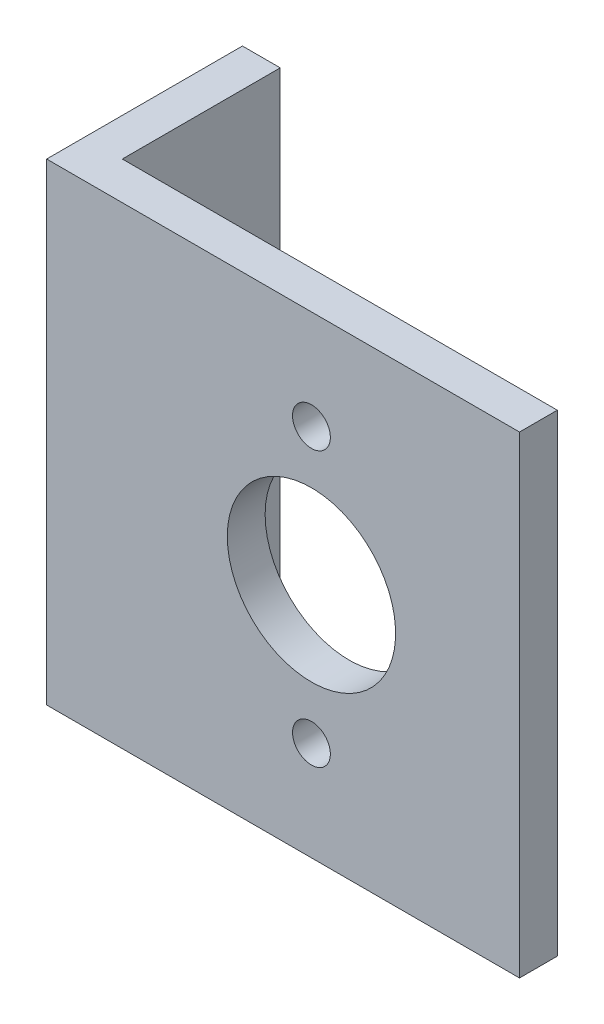
ISO-10303-21;
HEADER;
FILE_DESCRIPTION(('STEP AP214'),'2;1');
FILE_NAME('part.step','',(''),(''),'','','');
FILE_SCHEMA(('AUTOMOTIVE_DESIGN { 1 0 10303 214 1 1 1 1 }'));
ENDSEC;
DATA;
#1=APPLICATION_CONTEXT('core data for automotive mechanical design processes');
#2=APPLICATION_PROTOCOL_DEFINITION('international standard','automotive_design',2000,#1);
#3=PRODUCT_CONTEXT('',#1,'mechanical');
#4=PRODUCT('Part','Part','',(#3));
#5=PRODUCT_RELATED_PRODUCT_CATEGORY('part','',(#4));
#6=PRODUCT_DEFINITION_FORMATION('','',#4);
#7=PRODUCT_DEFINITION_CONTEXT('part definition',#1,'design');
#8=PRODUCT_DEFINITION('design','',#6,#7);
#9=PRODUCT_DEFINITION_SHAPE('','',#8);
#10=(LENGTH_UNIT() NAMED_UNIT(*) SI_UNIT(.MILLI.,.METRE.));
#11=(NAMED_UNIT(*) PLANE_ANGLE_UNIT() SI_UNIT($,.RADIAN.));
#12=(NAMED_UNIT(*) SI_UNIT($,.STERADIAN.) SOLID_ANGLE_UNIT());
#13=UNCERTAINTY_MEASURE_WITH_UNIT(LENGTH_MEASURE(1.E-05),#10,'distance_accuracy_value','');
#14=(GEOMETRIC_REPRESENTATION_CONTEXT(3) GLOBAL_UNCERTAINTY_ASSIGNED_CONTEXT((#13)) GLOBAL_UNIT_ASSIGNED_CONTEXT((#10,
#11,#12)) REPRESENTATION_CONTEXT('',''));
#15=CARTESIAN_POINT('',(0.,0.,0.));
#16=DIRECTION('',(0.,0.,1.));
#17=DIRECTION('',(1.,0.,0.));
#18=AXIS2_PLACEMENT_3D('',#15,#16,#17);
#19=CARTESIAN_POINT('',(0.,50.,0.));
#20=DIRECTION('',(0.,0.,-1.));
#21=DIRECTION('',(-1.,0.,0.));
#22=AXIS2_PLACEMENT_3D('',#19,#20,#21);
#23=PLANE('',#22);
#24=CARTESIAN_POINT('',(28.,10.5,0.));
#25=DIRECTION('',(0.,0.,-1.));
#26=DIRECTION('',(-1.,0.,0.));
#27=AXIS2_PLACEMENT_3D('',#24,#25,#26);
#28=CIRCLE('',#27,2.);
#29=CARTESIAN_POINT('',(26.,10.5,0.));
#30=VERTEX_POINT('',#29);
#31=EDGE_CURVE('E169',#30,#30,#28,.T.);
#32=ORIENTED_EDGE('',*,*,#31,.T.);
#33=EDGE_LOOP('',(#32));
#34=FACE_BOUND('',#33,.T.);
#35=CARTESIAN_POINT('',(28.,39.5,0.));
#36=DIRECTION('',(0.,0.,-1.));
#37=DIRECTION('',(-1.,0.,0.));
#38=AXIS2_PLACEMENT_3D('',#35,#36,#37);
#39=CIRCLE('',#38,2.);
#40=CARTESIAN_POINT('',(26.,39.5,0.));
#41=VERTEX_POINT('',#40);
#42=EDGE_CURVE('E163',#41,#41,#39,.T.);
#43=ORIENTED_EDGE('',*,*,#42,.T.);
#44=EDGE_LOOP('',(#43));
#45=FACE_BOUND('',#44,.T.);
#46=CARTESIAN_POINT('',(28.,25.,0.));
#47=DIRECTION('',(0.,0.,-1.));
#48=DIRECTION('',(-1.,0.,0.));
#49=AXIS2_PLACEMENT_3D('',#46,#47,#48);
#50=CIRCLE('',#49,8.9);
#51=CARTESIAN_POINT('',(19.1,25.,0.));
#52=VERTEX_POINT('',#51);
#53=EDGE_CURVE('E157',#52,#52,#50,.T.);
#54=ORIENTED_EDGE('',*,*,#53,.T.);
#55=EDGE_LOOP('',(#54));
#56=FACE_BOUND('',#55,.T.);
#57=DIRECTION('',(1.,0.,0.));
#58=VECTOR('',#57,1.);
#59=CARTESIAN_POINT('',(0.,0.,0.));
#60=LINE('',#59,#58);
#61=CARTESIAN_POINT('',(0.,0.,0.));
#62=VERTEX_POINT('',#61);
#63=CARTESIAN_POINT('',(50.,0.,0.));
#64=VERTEX_POINT('',#63);
#65=EDGE_CURVE('E123',#62,#64,#60,.T.);
#66=ORIENTED_EDGE('',*,*,#65,.T.);
#67=DIRECTION('',(0.,-1.,0.));
#68=VECTOR('',#67,1.);
#69=CARTESIAN_POINT('',(50.,50.,0.));
#70=LINE('',#69,#68);
#71=CARTESIAN_POINT('',(50.,50.,0.));
#72=VERTEX_POINT('',#71);
#73=EDGE_CURVE('E43',#72,#64,#70,.T.);
#74=ORIENTED_EDGE('',*,*,#73,.F.);
#75=DIRECTION('',(1.,0.,0.));
#76=VECTOR('',#75,1.);
#77=CARTESIAN_POINT('',(0.,50.,0.));
#78=LINE('',#77,#76);
#79=CARTESIAN_POINT('',(0.,50.,0.));
#80=VERTEX_POINT('',#79);
#81=EDGE_CURVE('E89',#80,#72,#78,.T.);
#82=ORIENTED_EDGE('',*,*,#81,.F.);
#83=DIRECTION('',(0.,-1.,0.));
#84=VECTOR('',#83,1.);
#85=CARTESIAN_POINT('',(0.,50.,0.));
#86=LINE('',#85,#84);
#87=EDGE_CURVE('E11',#80,#62,#86,.T.);
#88=ORIENTED_EDGE('',*,*,#87,.T.);
#89=EDGE_LOOP('',(#66,#74,#82,#88));
#90=FACE_BOUND('',#89,.T.);
#91=ADVANCED_FACE('F35',(#34,#45,#56,#90),#23,.F.);
#92=CARTESIAN_POINT('',(50.,50.,0.));
#93=DIRECTION('',(-1.,0.,0.));
#94=DIRECTION('',(0.,0.,1.));
#95=AXIS2_PLACEMENT_3D('',#92,#93,#94);
#96=PLANE('',#95);
#97=DIRECTION('',(0.,0.,-1.));
#98=VECTOR('',#97,1.);
#99=CARTESIAN_POINT('',(50.,0.,0.));
#100=LINE('',#99,#98);
#101=CARTESIAN_POINT('',(50.,0.,-4.));
#102=VERTEX_POINT('',#101);
#103=EDGE_CURVE('E125',#64,#102,#100,.T.);
#104=ORIENTED_EDGE('',*,*,#103,.T.);
#105=DIRECTION('',(0.,-1.,0.));
#106=VECTOR('',#105,1.);
#107=CARTESIAN_POINT('',(50.,50.,-4.));
#108=LINE('',#107,#106);
#109=CARTESIAN_POINT('',(50.,50.,-4.));
#110=VERTEX_POINT('',#109);
#111=EDGE_CURVE('E112',#110,#102,#108,.T.);
#112=ORIENTED_EDGE('',*,*,#111,.F.);
#113=DIRECTION('',(0.,0.,-1.));
#114=VECTOR('',#113,1.);
#115=CARTESIAN_POINT('',(50.,50.,0.));
#116=LINE('',#115,#114);
#117=EDGE_CURVE('E103',#72,#110,#116,.T.);
#118=ORIENTED_EDGE('',*,*,#117,.F.);
#119=ORIENTED_EDGE('',*,*,#73,.T.);
#120=EDGE_LOOP('',(#104,#112,#118,#119));
#121=FACE_BOUND('',#120,.T.);
#122=ADVANCED_FACE('F138',(#121),#96,.F.);
#123=CARTESIAN_POINT('',(4.,50.,-4.));
#124=DIRECTION('',(0.,0.,1.));
#125=DIRECTION('',(1.,0.,0.));
#126=AXIS2_PLACEMENT_3D('',#123,#124,#125);
#127=PLANE('',#126);
#128=CARTESIAN_POINT('',(28.,10.5,-4.));
#129=DIRECTION('',(0.,0.,-1.));
#130=DIRECTION('',(-1.,0.,0.));
#131=AXIS2_PLACEMENT_3D('',#128,#129,#130);
#132=CIRCLE('',#131,2.);
#133=CARTESIAN_POINT('',(26.,10.5,-4.));
#134=VERTEX_POINT('',#133);
#135=EDGE_CURVE('E172',#134,#134,#132,.T.);
#136=ORIENTED_EDGE('',*,*,#135,.F.);
#137=EDGE_LOOP('',(#136));
#138=FACE_BOUND('',#137,.T.);
#139=CARTESIAN_POINT('',(28.,39.5,-4.));
#140=DIRECTION('',(0.,0.,-1.));
#141=DIRECTION('',(-1.,0.,0.));
#142=AXIS2_PLACEMENT_3D('',#139,#140,#141);
#143=CIRCLE('',#142,2.);
#144=CARTESIAN_POINT('',(26.,39.5,-4.));
#145=VERTEX_POINT('',#144);
#146=EDGE_CURVE('E166',#145,#145,#143,.T.);
#147=ORIENTED_EDGE('',*,*,#146,.F.);
#148=EDGE_LOOP('',(#147));
#149=FACE_BOUND('',#148,.T.);
#150=CARTESIAN_POINT('',(28.,25.,-4.));
#151=DIRECTION('',(0.,0.,-1.));
#152=DIRECTION('',(-1.,0.,0.));
#153=AXIS2_PLACEMENT_3D('',#150,#151,#152);
#154=CIRCLE('',#153,8.9);
#155=CARTESIAN_POINT('',(19.1,25.,-4.));
#156=VERTEX_POINT('',#155);
#157=EDGE_CURVE('E160',#156,#156,#154,.T.);
#158=ORIENTED_EDGE('',*,*,#157,.F.);
#159=EDGE_LOOP('',(#158));
#160=FACE_BOUND('',#159,.T.);
#161=DIRECTION('',(-1.,0.,0.));
#162=VECTOR('',#161,1.);
#163=CARTESIAN_POINT('',(4.,0.,-4.));
#164=LINE('',#163,#162);
#165=CARTESIAN_POINT('',(4.,0.,-4.));
#166=VERTEX_POINT('',#165);
#167=EDGE_CURVE('E111',#102,#166,#164,.T.);
#168=ORIENTED_EDGE('',*,*,#167,.T.);
#169=DIRECTION('',(0.,-1.,0.));
#170=VECTOR('',#169,1.);
#171=CARTESIAN_POINT('',(4.,50.,-4.));
#172=LINE('',#171,#170);
#173=CARTESIAN_POINT('',(4.,50.,-4.));
#174=VERTEX_POINT('',#173);
#175=EDGE_CURVE('E108',#174,#166,#172,.T.);
#176=ORIENTED_EDGE('',*,*,#175,.F.);
#177=DIRECTION('',(-1.,0.,0.));
#178=VECTOR('',#177,1.);
#179=CARTESIAN_POINT('',(4.,50.,-4.));
#180=LINE('',#179,#178);
#181=EDGE_CURVE('E97',#110,#174,#180,.T.);
#182=ORIENTED_EDGE('',*,*,#181,.F.);
#183=ORIENTED_EDGE('',*,*,#111,.T.);
#184=EDGE_LOOP('',(#168,#176,#182,#183));
#185=FACE_BOUND('',#184,.T.);
#186=ADVANCED_FACE('F109',(#138,#149,#160,#185),#127,.F.);
#187=CARTESIAN_POINT('',(4.,50.,-4.));
#188=DIRECTION('',(-1.,0.,0.));
#189=DIRECTION('',(0.,0.,1.));
#190=AXIS2_PLACEMENT_3D('',#187,#188,#189);
#191=PLANE('',#190);
#192=CARTESIAN_POINT('',(4.,15.,-9.99999999999999));
#193=DIRECTION('',(-1.,0.,0.));
#194=DIRECTION('',(0.,0.,1.));
#195=AXIS2_PLACEMENT_3D('',#192,#193,#194);
#196=CIRCLE('',#195,3.);
#197=CARTESIAN_POINT('',(4.,15.,-7.));
#198=VERTEX_POINT('',#197);
#199=EDGE_CURVE('E151',#198,#198,#196,.T.);
#200=ORIENTED_EDGE('',*,*,#199,.T.);
#201=EDGE_LOOP('',(#200));
#202=FACE_BOUND('',#201,.T.);
#203=CARTESIAN_POINT('',(4.,35.,-10.));
#204=DIRECTION('',(-1.,0.,0.));
#205=DIRECTION('',(0.,0.,1.));
#206=AXIS2_PLACEMENT_3D('',#203,#204,#205);
#207=CIRCLE('',#206,3.);
#208=CARTESIAN_POINT('',(4.,35.,-7.));
#209=VERTEX_POINT('',#208);
#210=EDGE_CURVE('E126',#209,#209,#207,.T.);
#211=ORIENTED_EDGE('',*,*,#210,.T.);
#212=EDGE_LOOP('',(#211));
#213=FACE_BOUND('',#212,.T.);
#214=DIRECTION('',(0.,0.,-1.));
#215=VECTOR('',#214,1.);
#216=CARTESIAN_POINT('',(4.,0.,-4.));
#217=LINE('',#216,#215);
#218=CARTESIAN_POINT('',(4.,0.,-20.7));
#219=VERTEX_POINT('',#218);
#220=EDGE_CURVE('E75',#166,#219,#217,.T.);
#221=ORIENTED_EDGE('',*,*,#220,.T.);
#222=DIRECTION('',(0.,-1.,0.));
#223=VECTOR('',#222,1.);
#224=CARTESIAN_POINT('',(4.,50.,-20.7));
#225=LINE('',#224,#223);
#226=CARTESIAN_POINT('',(4.,50.,-20.7));
#227=VERTEX_POINT('',#226);
#228=EDGE_CURVE('E113',#227,#219,#225,.T.);
#229=ORIENTED_EDGE('',*,*,#228,.F.);
#230=DIRECTION('',(0.,0.,-1.));
#231=VECTOR('',#230,1.);
#232=CARTESIAN_POINT('',(4.,50.,-4.));
#233=LINE('',#232,#231);
#234=EDGE_CURVE('E101',#174,#227,#233,.T.);
#235=ORIENTED_EDGE('',*,*,#234,.F.);
#236=ORIENTED_EDGE('',*,*,#175,.T.);
#237=EDGE_LOOP('',(#221,#229,#235,#236));
#238=FACE_BOUND('',#237,.T.);
#239=ADVANCED_FACE('F115',(#202,#213,#238),#191,.F.);
#240=CARTESIAN_POINT('',(0.,50.,-20.7));
#241=DIRECTION('',(0.,0.,1.));
#242=DIRECTION('',(1.,0.,0.));
#243=AXIS2_PLACEMENT_3D('',#240,#241,#242);
#244=PLANE('',#243);
#245=DIRECTION('',(-1.,0.,0.));
#246=VECTOR('',#245,1.);
#247=CARTESIAN_POINT('',(0.,0.,-20.7));
#248=LINE('',#247,#246);
#249=CARTESIAN_POINT('',(0.,0.,-20.7));
#250=VERTEX_POINT('',#249);
#251=EDGE_CURVE('E82',#219,#250,#248,.T.);
#252=ORIENTED_EDGE('',*,*,#251,.T.);
#253=DIRECTION('',(0.,-1.,0.));
#254=VECTOR('',#253,1.);
#255=CARTESIAN_POINT('',(0.,50.,-20.7));
#256=LINE('',#255,#254);
#257=CARTESIAN_POINT('',(0.,50.,-20.7));
#258=VERTEX_POINT('',#257);
#259=EDGE_CURVE('E119',#258,#250,#256,.T.);
#260=ORIENTED_EDGE('',*,*,#259,.F.);
#261=DIRECTION('',(-1.,0.,0.));
#262=VECTOR('',#261,1.);
#263=CARTESIAN_POINT('',(0.,50.,-20.7));
#264=LINE('',#263,#262);
#265=EDGE_CURVE('E117',#227,#258,#264,.T.);
#266=ORIENTED_EDGE('',*,*,#265,.F.);
#267=ORIENTED_EDGE('',*,*,#228,.T.);
#268=EDGE_LOOP('',(#252,#260,#266,#267));
#269=FACE_BOUND('',#268,.T.);
#270=ADVANCED_FACE('F144',(#269),#244,.F.);
#271=CARTESIAN_POINT('',(0.,50.,-4.));
#272=DIRECTION('',(1.,0.,0.));
#273=DIRECTION('',(0.,0.,-1.));
#274=AXIS2_PLACEMENT_3D('',#271,#272,#273);
#275=PLANE('',#274);
#276=CARTESIAN_POINT('',(0.,15.,-9.99999999999999));
#277=DIRECTION('',(-1.,0.,0.));
#278=DIRECTION('',(0.,0.,1.));
#279=AXIS2_PLACEMENT_3D('',#276,#277,#278);
#280=CIRCLE('',#279,3.);
#281=CARTESIAN_POINT('',(0.,15.,-7.));
#282=VERTEX_POINT('',#281);
#283=EDGE_CURVE('E154',#282,#282,#280,.T.);
#284=ORIENTED_EDGE('',*,*,#283,.F.);
#285=EDGE_LOOP('',(#284));
#286=FACE_BOUND('',#285,.T.);
#287=CARTESIAN_POINT('',(0.,35.,-10.));
#288=DIRECTION('',(-1.,0.,0.));
#289=DIRECTION('',(0.,0.,1.));
#290=AXIS2_PLACEMENT_3D('',#287,#288,#289);
#291=CIRCLE('',#290,3.);
#292=CARTESIAN_POINT('',(0.,35.,-7.));
#293=VERTEX_POINT('',#292);
#294=EDGE_CURVE('E148',#293,#293,#291,.T.);
#295=ORIENTED_EDGE('',*,*,#294,.F.);
#296=EDGE_LOOP('',(#295));
#297=FACE_BOUND('',#296,.T.);
#298=DIRECTION('',(0.,0.,1.));
#299=VECTOR('',#298,1.);
#300=CARTESIAN_POINT('',(0.,0.,-4.));
#301=LINE('',#300,#299);
#302=EDGE_CURVE('E131',#250,#62,#301,.T.);
#303=ORIENTED_EDGE('',*,*,#302,.T.);
#304=ORIENTED_EDGE('',*,*,#87,.F.);
#305=DIRECTION('',(0.,0.,1.));
#306=VECTOR('',#305,1.);
#307=CARTESIAN_POINT('',(0.,50.,0.));
#308=LINE('',#307,#306);
#309=EDGE_CURVE('E51',#258,#80,#308,.T.);
#310=ORIENTED_EDGE('',*,*,#309,.F.);
#311=ORIENTED_EDGE('',*,*,#259,.T.);
#312=EDGE_LOOP('',(#303,#304,#310,#311));
#313=FACE_BOUND('',#312,.T.);
#314=ADVANCED_FACE('F143',(#286,#297,#313),#275,.F.);
#315=CARTESIAN_POINT('',(0.,50.,0.));
#316=DIRECTION('',(0.,-1.,0.));
#317=DIRECTION('',(0.,0.,-1.));
#318=AXIS2_PLACEMENT_3D('',#315,#316,#317);
#319=PLANE('',#318);
#320=ORIENTED_EDGE('',*,*,#309,.T.);
#321=ORIENTED_EDGE('',*,*,#81,.T.);
#322=ORIENTED_EDGE('',*,*,#117,.T.);
#323=ORIENTED_EDGE('',*,*,#181,.T.);
#324=ORIENTED_EDGE('',*,*,#234,.T.);
#325=ORIENTED_EDGE('',*,*,#265,.T.);
#326=EDGE_LOOP('',(#320,#321,#322,#323,#324,#325));
#327=FACE_BOUND('',#326,.T.);
#328=ADVANCED_FACE('F99',(#327),#319,.F.);
#329=CARTESIAN_POINT('',(0.,0.,0.));
#330=DIRECTION('',(0.,-1.,0.));
#331=DIRECTION('',(0.,0.,-1.));
#332=AXIS2_PLACEMENT_3D('',#329,#330,#331);
#333=PLANE('',#332);
#334=ORIENTED_EDGE('',*,*,#65,.F.);
#335=ORIENTED_EDGE('',*,*,#302,.F.);
#336=ORIENTED_EDGE('',*,*,#251,.F.);
#337=ORIENTED_EDGE('',*,*,#220,.F.);
#338=ORIENTED_EDGE('',*,*,#167,.F.);
#339=ORIENTED_EDGE('',*,*,#103,.F.);
#340=EDGE_LOOP('',(#334,#335,#336,#337,#338,#339));
#341=FACE_BOUND('',#340,.T.);
#342=ADVANCED_FACE('F141',(#341),#333,.T.);
#343=CARTESIAN_POINT('',(4.,35.,-10.));
#344=DIRECTION('',(-1.,0.,0.));
#345=DIRECTION('',(0.,0.,1.));
#346=AXIS2_PLACEMENT_3D('',#343,#344,#345);
#347=CYLINDRICAL_SURFACE('',#346,3.);
#348=ORIENTED_EDGE('',*,*,#210,.F.);
#349=EDGE_LOOP('',(#348));
#350=FACE_BOUND('',#349,.T.);
#351=ORIENTED_EDGE('',*,*,#294,.T.);
#352=EDGE_LOOP('',(#351));
#353=FACE_BOUND('',#352,.T.);
#354=ADVANCED_FACE('F205',(#350,#353),#347,.F.);
#355=CARTESIAN_POINT('',(4.,15.,-9.99999999999999));
#356=DIRECTION('',(-1.,0.,0.));
#357=DIRECTION('',(0.,0.,1.));
#358=AXIS2_PLACEMENT_3D('',#355,#356,#357);
#359=CYLINDRICAL_SURFACE('',#358,3.);
#360=ORIENTED_EDGE('',*,*,#199,.F.);
#361=EDGE_LOOP('',(#360));
#362=FACE_BOUND('',#361,.T.);
#363=ORIENTED_EDGE('',*,*,#283,.T.);
#364=EDGE_LOOP('',(#363));
#365=FACE_BOUND('',#364,.T.);
#366=ADVANCED_FACE('F196',(#362,#365),#359,.F.);
#367=CARTESIAN_POINT('',(28.,25.,0.));
#368=DIRECTION('',(0.,0.,-1.));
#369=DIRECTION('',(-1.,0.,0.));
#370=AXIS2_PLACEMENT_3D('',#367,#368,#369);
#371=CYLINDRICAL_SURFACE('',#370,8.9);
#372=ORIENTED_EDGE('',*,*,#53,.F.);
#373=EDGE_LOOP('',(#372));
#374=FACE_BOUND('',#373,.T.);
#375=ORIENTED_EDGE('',*,*,#157,.T.);
#376=EDGE_LOOP('',(#375));
#377=FACE_BOUND('',#376,.T.);
#378=ADVANCED_FACE('F194',(#374,#377),#371,.F.);
#379=CARTESIAN_POINT('',(28.,39.5,0.));
#380=DIRECTION('',(0.,0.,-1.));
#381=DIRECTION('',(-1.,0.,0.));
#382=AXIS2_PLACEMENT_3D('',#379,#380,#381);
#383=CYLINDRICAL_SURFACE('',#382,2.);
#384=ORIENTED_EDGE('',*,*,#42,.F.);
#385=EDGE_LOOP('',(#384));
#386=FACE_BOUND('',#385,.T.);
#387=ORIENTED_EDGE('',*,*,#146,.T.);
#388=EDGE_LOOP('',(#387));
#389=FACE_BOUND('',#388,.T.);
#390=ADVANCED_FACE('F183',(#386,#389),#383,.F.);
#391=CARTESIAN_POINT('',(28.,10.5,0.));
#392=DIRECTION('',(0.,0.,-1.));
#393=DIRECTION('',(-1.,0.,0.));
#394=AXIS2_PLACEMENT_3D('',#391,#392,#393);
#395=CYLINDRICAL_SURFACE('',#394,2.);
#396=ORIENTED_EDGE('',*,*,#31,.F.);
#397=EDGE_LOOP('',(#396));
#398=FACE_BOUND('',#397,.T.);
#399=ORIENTED_EDGE('',*,*,#135,.T.);
#400=EDGE_LOOP('',(#399));
#401=FACE_BOUND('',#400,.T.);
#402=ADVANCED_FACE('F180',(#398,#401),#395,.F.);
#403=CLOSED_SHELL('',(#91,#122,#186,#239,#270,#314,#328,#342,#354,#366,#378,#390,#402));
#404=MANIFOLD_SOLID_BREP('B2',#403);
#405=ADVANCED_BREP_SHAPE_REPRESENTATION('',(#18,#404),#14);
#406=SHAPE_DEFINITION_REPRESENTATION(#9,#405);
ENDSEC;
END-ISO-10303-21;
